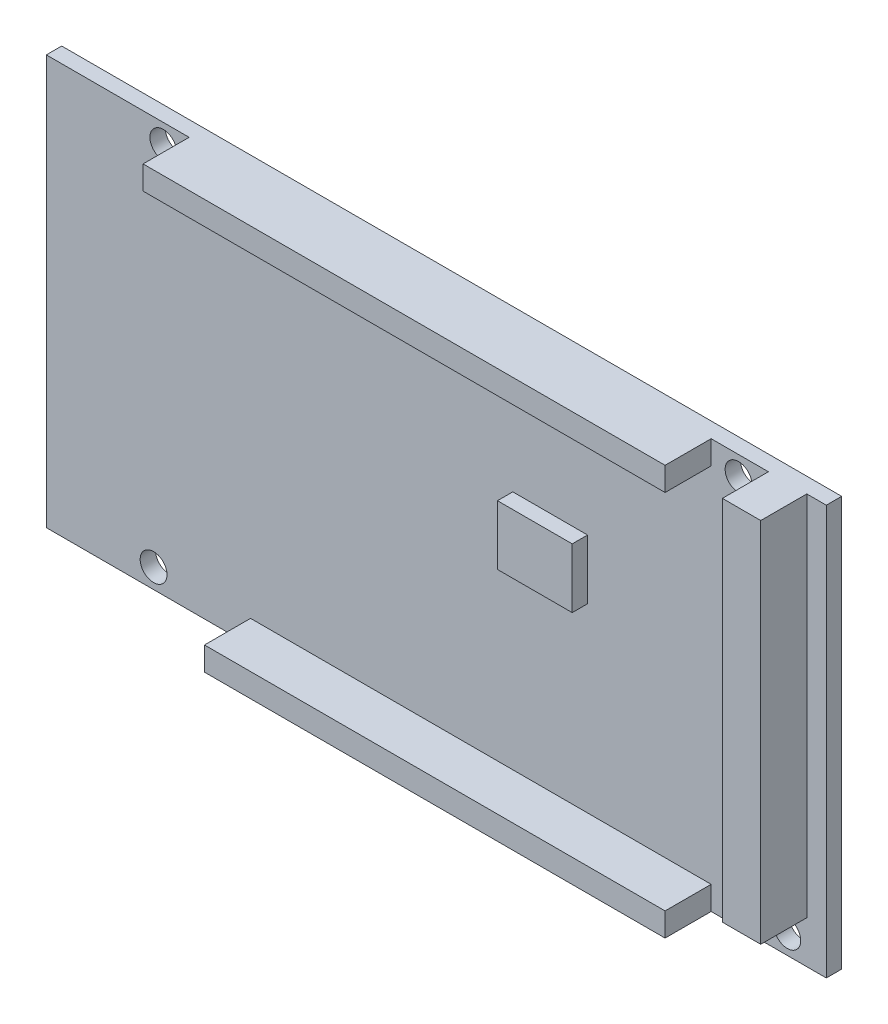
ISO-10303-21;
HEADER;
FILE_DESCRIPTION(('STEP AP214'),'2;1');
FILE_NAME('part.step','',(''),(''),'','','');
FILE_SCHEMA(('AUTOMOTIVE_DESIGN { 1 0 10303 214 1 1 1 1 }'));
ENDSEC;
DATA;
#1=APPLICATION_CONTEXT('core data for automotive mechanical design processes');
#2=APPLICATION_PROTOCOL_DEFINITION('international standard','automotive_design',2000,#1);
#3=PRODUCT_CONTEXT('',#1,'mechanical');
#4=PRODUCT('Part','Part','',(#3));
#5=PRODUCT_RELATED_PRODUCT_CATEGORY('part','',(#4));
#6=PRODUCT_DEFINITION_FORMATION('','',#4);
#7=PRODUCT_DEFINITION_CONTEXT('part definition',#1,'design');
#8=PRODUCT_DEFINITION('design','',#6,#7);
#9=PRODUCT_DEFINITION_SHAPE('','',#8);
#10=(LENGTH_UNIT() NAMED_UNIT(*) SI_UNIT(.MILLI.,.METRE.));
#11=(NAMED_UNIT(*) PLANE_ANGLE_UNIT() SI_UNIT($,.RADIAN.));
#12=(NAMED_UNIT(*) SI_UNIT($,.STERADIAN.) SOLID_ANGLE_UNIT());
#13=UNCERTAINTY_MEASURE_WITH_UNIT(LENGTH_MEASURE(1.E-05),#10,'distance_accuracy_value','');
#14=(GEOMETRIC_REPRESENTATION_CONTEXT(3) GLOBAL_UNCERTAINTY_ASSIGNED_CONTEXT((#13)) GLOBAL_UNIT_ASSIGNED_CONTEXT((#10,
#11,#12)) REPRESENTATION_CONTEXT('',''));
#15=CARTESIAN_POINT('',(0.,0.,0.));
#16=DIRECTION('',(0.,0.,1.));
#17=DIRECTION('',(1.,0.,0.));
#18=AXIS2_PLACEMENT_3D('',#15,#16,#17);
#19=CARTESIAN_POINT('',(0.,0.,2.));
#20=DIRECTION('',(0.,0.,-1.));
#21=DIRECTION('',(-1.,0.,0.));
#22=AXIS2_PLACEMENT_3D('',#19,#20,#21);
#23=PLANE('',#22);
#24=DIRECTION('',(0.,-1.,0.));
#25=VECTOR('',#24,1.);
#26=CARTESIAN_POINT('',(43.26,26.67,2.));
#27=LINE('',#26,#25);
#28=CARTESIAN_POINT('',(43.26,26.67,2.));
#29=VERTEX_POINT('',#28);
#30=CARTESIAN_POINT('',(43.26,-21.14,2.));
#31=VERTEX_POINT('',#30);
#32=EDGE_CURVE('E195',#29,#31,#27,.T.);
#33=ORIENTED_EDGE('',*,*,#32,.F.);
#34=DIRECTION('',(-1.,0.,0.));
#35=VECTOR('',#34,1.);
#36=CARTESIAN_POINT('',(-50.8,26.67,2.));
#37=LINE('',#36,#35);
#38=CARTESIAN_POINT('',(35.8,26.67,2.));
#39=VERTEX_POINT('',#38);
#40=EDGE_CURVE('E38',#29,#39,#37,.T.);
#41=ORIENTED_EDGE('',*,*,#40,.T.);
#42=DIRECTION('',(0.,1.,0.));
#43=VECTOR('',#42,1.);
#44=CARTESIAN_POINT('',(35.8,26.67,2.));
#45=LINE('',#44,#43);
#46=CARTESIAN_POINT('',(35.8,23.6,2.));
#47=VERTEX_POINT('',#46);
#48=EDGE_CURVE('E265',#47,#39,#45,.T.);
#49=ORIENTED_EDGE('',*,*,#48,.F.);
#50=DIRECTION('',(1.,0.,0.));
#51=VECTOR('',#50,1.);
#52=CARTESIAN_POINT('',(-32.2,23.6,2.));
#53=LINE('',#52,#51);
#54=CARTESIAN_POINT('',(-32.2,23.6,2.));
#55=VERTEX_POINT('',#54);
#56=EDGE_CURVE('E272',#55,#47,#53,.T.);
#57=ORIENTED_EDGE('',*,*,#56,.F.);
#58=DIRECTION('',(0.,-1.,0.));
#59=VECTOR('',#58,1.);
#60=CARTESIAN_POINT('',(-32.2,26.67,2.));
#61=LINE('',#60,#59);
#62=CARTESIAN_POINT('',(-32.2,26.67,2.));
#63=VERTEX_POINT('',#62);
#64=EDGE_CURVE('E260',#63,#55,#61,.T.);
#65=ORIENTED_EDGE('',*,*,#64,.F.);
#66=CARTESIAN_POINT('',(-50.8,26.67,2.));
#67=VERTEX_POINT('',#66);
#68=EDGE_CURVE('E302',#63,#67,#37,.T.);
#69=ORIENTED_EDGE('',*,*,#68,.T.);
#70=DIRECTION('',(0.,-1.,0.));
#71=VECTOR('',#70,1.);
#72=CARTESIAN_POINT('',(-50.8,-26.67,2.));
#73=LINE('',#72,#71);
#74=CARTESIAN_POINT('',(-50.8,-26.67,2.));
#75=VERTEX_POINT('',#74);
#76=EDGE_CURVE('E310',#67,#75,#73,.T.);
#77=ORIENTED_EDGE('',*,*,#76,.T.);
#78=DIRECTION('',(1.,0.,0.));
#79=VECTOR('',#78,1.);
#80=CARTESIAN_POINT('',(-50.8,-26.67,2.));
#81=LINE('',#80,#79);
#82=CARTESIAN_POINT('',(-24.2,-26.67,2.));
#83=VERTEX_POINT('',#82);
#84=EDGE_CURVE('E315',#75,#83,#81,.T.);
#85=ORIENTED_EDGE('',*,*,#84,.T.);
#86=DIRECTION('',(0.,-1.,0.));
#87=VECTOR('',#86,1.);
#88=CARTESIAN_POINT('',(-24.2,-26.67,2.));
#89=LINE('',#88,#87);
#90=CARTESIAN_POINT('',(-24.2,-23.6,2.));
#91=VERTEX_POINT('',#90);
#92=EDGE_CURVE('E230',#91,#83,#89,.T.);
#93=ORIENTED_EDGE('',*,*,#92,.F.);
#94=DIRECTION('',(-1.,0.,0.));
#95=VECTOR('',#94,1.);
#96=CARTESIAN_POINT('',(-24.2,-23.6,2.));
#97=LINE('',#96,#95);
#98=CARTESIAN_POINT('',(35.8,-23.6,2.));
#99=VERTEX_POINT('',#98);
#100=EDGE_CURVE('E235',#99,#91,#97,.T.);
#101=ORIENTED_EDGE('',*,*,#100,.F.);
#102=DIRECTION('',(0.,1.,0.));
#103=VECTOR('',#102,1.);
#104=CARTESIAN_POINT('',(35.8,-26.67,2.));
#105=LINE('',#104,#103);
#106=CARTESIAN_POINT('',(35.8,-26.67,2.));
#107=VERTEX_POINT('',#106);
#108=EDGE_CURVE('E244',#107,#99,#105,.T.);
#109=ORIENTED_EDGE('',*,*,#108,.F.);
#110=CARTESIAN_POINT('',(50.8,-26.67,2.));
#111=VERTEX_POINT('',#110);
#112=EDGE_CURVE('E314',#107,#111,#81,.T.);
#113=ORIENTED_EDGE('',*,*,#112,.T.);
#114=DIRECTION('',(0.,1.,0.));
#115=VECTOR('',#114,1.);
#116=CARTESIAN_POINT('',(50.8,-26.67,2.));
#117=LINE('',#116,#115);
#118=CARTESIAN_POINT('',(50.8,26.67,2.));
#119=VERTEX_POINT('',#118);
#120=EDGE_CURVE('E304',#111,#119,#117,.T.);
#121=ORIENTED_EDGE('',*,*,#120,.T.);
#122=CARTESIAN_POINT('',(48.26,26.67,2.));
#123=VERTEX_POINT('',#122);
#124=EDGE_CURVE('E305',#119,#123,#37,.T.);
#125=ORIENTED_EDGE('',*,*,#124,.T.);
#126=DIRECTION('',(0.,1.,0.));
#127=VECTOR('',#126,1.);
#128=CARTESIAN_POINT('',(48.26,26.67,2.));
#129=LINE('',#128,#127);
#130=CARTESIAN_POINT('',(48.26,-21.14,2.));
#131=VERTEX_POINT('',#130);
#132=EDGE_CURVE('E208',#131,#123,#129,.T.);
#133=ORIENTED_EDGE('',*,*,#132,.F.);
#134=DIRECTION('',(1.,0.,0.));
#135=VECTOR('',#134,1.);
#136=CARTESIAN_POINT('',(43.26,-21.14,2.));
#137=LINE('',#136,#135);
#138=EDGE_CURVE('E198',#31,#131,#137,.T.);
#139=ORIENTED_EDGE('',*,*,#138,.F.);
#140=EDGE_LOOP('',(#33,#41,#49,#57,#65,#69,#77,#85,#93,#101,#109,#113,#121,#125,#133,#139));
#141=FACE_BOUND('',#140,.T.);
#142=CARTESIAN_POINT('',(-35.56,24.13,2.));
#143=DIRECTION('',(0.,0.,1.));
#144=DIRECTION('',(1.,0.,0.));
#145=AXIS2_PLACEMENT_3D('',#142,#143,#144);
#146=CIRCLE('',#145,1.75);
#147=CARTESIAN_POINT('',(-33.81,24.13,2.));
#148=VERTEX_POINT('',#147);
#149=EDGE_CURVE('E322',#148,#148,#146,.T.);
#150=ORIENTED_EDGE('',*,*,#149,.F.);
#151=EDGE_LOOP('',(#150));
#152=FACE_BOUND('',#151,.T.);
#153=CARTESIAN_POINT('',(-36.83,-24.13,2.));
#154=DIRECTION('',(0.,0.,1.));
#155=DIRECTION('',(1.,0.,0.));
#156=AXIS2_PLACEMENT_3D('',#153,#154,#155);
#157=CIRCLE('',#156,1.75);
#158=CARTESIAN_POINT('',(-35.08,-24.13,2.));
#159=VERTEX_POINT('',#158);
#160=EDGE_CURVE('E397',#159,#159,#157,.T.);
#161=ORIENTED_EDGE('',*,*,#160,.F.);
#162=EDGE_LOOP('',(#161));
#163=FACE_BOUND('',#162,.T.);
#164=CARTESIAN_POINT('',(45.72,-24.13,2.));
#165=DIRECTION('',(0.,0.,1.));
#166=DIRECTION('',(1.,0.,0.));
#167=AXIS2_PLACEMENT_3D('',#164,#165,#166);
#168=CIRCLE('',#167,1.75);
#169=CARTESIAN_POINT('',(47.47,-24.13,2.));
#170=VERTEX_POINT('',#169);
#171=EDGE_CURVE('E391',#170,#170,#168,.T.);
#172=ORIENTED_EDGE('',*,*,#171,.F.);
#173=EDGE_LOOP('',(#172));
#174=FACE_BOUND('',#173,.T.);
#175=CARTESIAN_POINT('',(39.37,24.13,2.));
#176=DIRECTION('',(0.,0.,1.));
#177=DIRECTION('',(1.,0.,0.));
#178=AXIS2_PLACEMENT_3D('',#175,#176,#177);
#179=CIRCLE('',#178,1.75);
#180=CARTESIAN_POINT('',(41.12,24.13,2.));
#181=VERTEX_POINT('',#180);
#182=EDGE_CURVE('E385',#181,#181,#179,.T.);
#183=ORIENTED_EDGE('',*,*,#182,.F.);
#184=EDGE_LOOP('',(#183));
#185=FACE_BOUND('',#184,.T.);
#186=DIRECTION('',(0.,-1.,0.));
#187=VECTOR('',#186,1.);
#188=CARTESIAN_POINT('',(9.96353676061924,0.,2.));
#189=LINE('',#188,#187);
#190=CARTESIAN_POINT('',(9.96353676061924,7.75574232218655,2.));
#191=VERTEX_POINT('',#190);
#192=CARTESIAN_POINT('',(9.96353676061924,0.,2.));
#193=VERTEX_POINT('',#192);
#194=EDGE_CURVE('E194',#191,#193,#189,.T.);
#195=ORIENTED_EDGE('',*,*,#194,.F.);
#196=DIRECTION('',(-1.,0.,0.));
#197=VECTOR('',#196,1.);
#198=CARTESIAN_POINT('',(9.96353676061924,7.75574232218655,2.));
#199=LINE('',#198,#197);
#200=CARTESIAN_POINT('',(19.7006417198608,7.75574232218655,2.));
#201=VERTEX_POINT('',#200);
#202=EDGE_CURVE('E191',#201,#191,#199,.T.);
#203=ORIENTED_EDGE('',*,*,#202,.F.);
#204=DIRECTION('',(0.,1.,0.));
#205=VECTOR('',#204,1.);
#206=CARTESIAN_POINT('',(19.7006417198608,0.,2.));
#207=LINE('',#206,#205);
#208=CARTESIAN_POINT('',(19.7006417198608,0.,2.));
#209=VERTEX_POINT('',#208);
#210=EDGE_CURVE('E57',#209,#201,#207,.T.);
#211=ORIENTED_EDGE('',*,*,#210,.F.);
#212=DIRECTION('',(1.,0.,0.));
#213=VECTOR('',#212,1.);
#214=CARTESIAN_POINT('',(9.96353676061924,0.,2.));
#215=LINE('',#214,#213);
#216=EDGE_CURVE('E52',#193,#209,#215,.T.);
#217=ORIENTED_EDGE('',*,*,#216,.F.);
#218=EDGE_LOOP('',(#195,#203,#211,#217));
#219=FACE_BOUND('',#218,.T.);
#220=ADVANCED_FACE('F34',(#141,#152,#163,#174,#185,#219),#23,.F.);
#221=CARTESIAN_POINT('',(0.,0.,0.));
#222=DIRECTION('',(0.,0.,-1.));
#223=DIRECTION('',(-1.,0.,0.));
#224=AXIS2_PLACEMENT_3D('',#221,#222,#223);
#225=PLANE('',#224);
#226=CARTESIAN_POINT('',(45.72,-24.13,0.));
#227=DIRECTION('',(0.,0.,1.));
#228=DIRECTION('',(1.,0.,0.));
#229=AXIS2_PLACEMENT_3D('',#226,#227,#228);
#230=CIRCLE('',#229,1.75);
#231=CARTESIAN_POINT('',(47.47,-24.13,0.));
#232=VERTEX_POINT('',#231);
#233=EDGE_CURVE('E389',#232,#232,#230,.T.);
#234=ORIENTED_EDGE('',*,*,#233,.T.);
#235=EDGE_LOOP('',(#234));
#236=FACE_BOUND('',#235,.T.);
#237=CARTESIAN_POINT('',(-35.56,24.13,0.));
#238=DIRECTION('',(0.,0.,1.));
#239=DIRECTION('',(1.,0.,0.));
#240=AXIS2_PLACEMENT_3D('',#237,#238,#239);
#241=CIRCLE('',#240,1.75);
#242=CARTESIAN_POINT('',(-33.81,24.13,0.));
#243=VERTEX_POINT('',#242);
#244=EDGE_CURVE('E400',#243,#243,#241,.T.);
#245=ORIENTED_EDGE('',*,*,#244,.T.);
#246=EDGE_LOOP('',(#245));
#247=FACE_BOUND('',#246,.T.);
#248=DIRECTION('',(0.,1.,0.));
#249=VECTOR('',#248,1.);
#250=CARTESIAN_POINT('',(50.8,-26.67,0.));
#251=LINE('',#250,#249);
#252=CARTESIAN_POINT('',(50.8,-26.67,0.));
#253=VERTEX_POINT('',#252);
#254=CARTESIAN_POINT('',(50.8,26.67,0.));
#255=VERTEX_POINT('',#254);
#256=EDGE_CURVE('E318',#253,#255,#251,.T.);
#257=ORIENTED_EDGE('',*,*,#256,.F.);
#258=DIRECTION('',(1.,0.,0.));
#259=VECTOR('',#258,1.);
#260=CARTESIAN_POINT('',(-50.8,-26.67,0.));
#261=LINE('',#260,#259);
#262=CARTESIAN_POINT('',(-50.8,-26.67,0.));
#263=VERTEX_POINT('',#262);
#264=EDGE_CURVE('E326',#263,#253,#261,.T.);
#265=ORIENTED_EDGE('',*,*,#264,.F.);
#266=DIRECTION('',(0.,-1.,0.));
#267=VECTOR('',#266,1.);
#268=CARTESIAN_POINT('',(-50.8,-26.67,0.));
#269=LINE('',#268,#267);
#270=CARTESIAN_POINT('',(-50.8,26.67,0.));
#271=VERTEX_POINT('',#270);
#272=EDGE_CURVE('E324',#271,#263,#269,.T.);
#273=ORIENTED_EDGE('',*,*,#272,.F.);
#274=DIRECTION('',(-1.,0.,0.));
#275=VECTOR('',#274,1.);
#276=CARTESIAN_POINT('',(-50.8,26.67,0.));
#277=LINE('',#276,#275);
#278=EDGE_CURVE('E321',#255,#271,#277,.T.);
#279=ORIENTED_EDGE('',*,*,#278,.F.);
#280=EDGE_LOOP('',(#257,#265,#273,#279));
#281=FACE_BOUND('',#280,.T.);
#282=CARTESIAN_POINT('',(-36.83,-24.13,0.));
#283=DIRECTION('',(0.,0.,1.));
#284=DIRECTION('',(1.,0.,0.));
#285=AXIS2_PLACEMENT_3D('',#282,#283,#284);
#286=CIRCLE('',#285,1.75);
#287=CARTESIAN_POINT('',(-35.08,-24.13,0.));
#288=VERTEX_POINT('',#287);
#289=EDGE_CURVE('E394',#288,#288,#286,.T.);
#290=ORIENTED_EDGE('',*,*,#289,.T.);
#291=EDGE_LOOP('',(#290));
#292=FACE_BOUND('',#291,.T.);
#293=CARTESIAN_POINT('',(39.37,24.13,0.));
#294=DIRECTION('',(0.,0.,1.));
#295=DIRECTION('',(1.,0.,0.));
#296=AXIS2_PLACEMENT_3D('',#293,#294,#295);
#297=CIRCLE('',#296,1.75);
#298=CARTESIAN_POINT('',(41.12,24.13,0.));
#299=VERTEX_POINT('',#298);
#300=EDGE_CURVE('E383',#299,#299,#297,.T.);
#301=ORIENTED_EDGE('',*,*,#300,.T.);
#302=EDGE_LOOP('',(#301));
#303=FACE_BOUND('',#302,.T.);
#304=ADVANCED_FACE('F344',(#236,#247,#281,#292,#303),#225,.T.);
#305=CARTESIAN_POINT('',(50.8,-26.67,2.));
#306=DIRECTION('',(-1.,0.,0.));
#307=DIRECTION('',(0.,0.,1.));
#308=AXIS2_PLACEMENT_3D('',#305,#306,#307);
#309=PLANE('',#308);
#310=ORIENTED_EDGE('',*,*,#256,.T.);
#311=DIRECTION('',(0.,0.,-1.));
#312=VECTOR('',#311,1.);
#313=CARTESIAN_POINT('',(50.8,26.67,2.));
#314=LINE('',#313,#312);
#315=EDGE_CURVE('E11',#119,#255,#314,.T.);
#316=ORIENTED_EDGE('',*,*,#315,.F.);
#317=ORIENTED_EDGE('',*,*,#120,.F.);
#318=DIRECTION('',(0.,0.,-1.));
#319=VECTOR('',#318,1.);
#320=CARTESIAN_POINT('',(50.8,-26.67,2.));
#321=LINE('',#320,#319);
#322=EDGE_CURVE('E317',#111,#253,#321,.T.);
#323=ORIENTED_EDGE('',*,*,#322,.T.);
#324=EDGE_LOOP('',(#310,#316,#317,#323));
#325=FACE_BOUND('',#324,.T.);
#326=ADVANCED_FACE('F36',(#325),#309,.F.);
#327=CARTESIAN_POINT('',(-50.8,26.67,2.));
#328=DIRECTION('',(0.,-1.,0.));
#329=DIRECTION('',(0.,0.,-1.));
#330=AXIS2_PLACEMENT_3D('',#327,#328,#329);
#331=PLANE('',#330);
#332=ORIENTED_EDGE('',*,*,#278,.T.);
#333=DIRECTION('',(0.,0.,-1.));
#334=VECTOR('',#333,1.);
#335=CARTESIAN_POINT('',(-50.8,26.67,2.));
#336=LINE('',#335,#334);
#337=EDGE_CURVE('E44',#67,#271,#336,.T.);
#338=ORIENTED_EDGE('',*,*,#337,.F.);
#339=ORIENTED_EDGE('',*,*,#68,.F.);
#340=DIRECTION('',(0.,0.,-1.));
#341=VECTOR('',#340,1.);
#342=CARTESIAN_POINT('',(-32.2,26.67,8.));
#343=LINE('',#342,#341);
#344=CARTESIAN_POINT('',(-32.2,26.67,8.));
#345=VERTEX_POINT('',#344);
#346=EDGE_CURVE('E271',#345,#63,#343,.T.);
#347=ORIENTED_EDGE('',*,*,#346,.F.);
#348=DIRECTION('',(-1.,0.,0.));
#349=VECTOR('',#348,1.);
#350=CARTESIAN_POINT('',(-32.2,26.67,8.));
#351=LINE('',#350,#349);
#352=CARTESIAN_POINT('',(35.8,26.67,8.));
#353=VERTEX_POINT('',#352);
#354=EDGE_CURVE('E269',#353,#345,#351,.T.);
#355=ORIENTED_EDGE('',*,*,#354,.F.);
#356=DIRECTION('',(0.,0.,-1.));
#357=VECTOR('',#356,1.);
#358=CARTESIAN_POINT('',(35.8,26.67,8.));
#359=LINE('',#358,#357);
#360=EDGE_CURVE('E285',#353,#39,#359,.T.);
#361=ORIENTED_EDGE('',*,*,#360,.T.);
#362=ORIENTED_EDGE('',*,*,#40,.F.);
#363=DIRECTION('',(0.,0.,-1.));
#364=VECTOR('',#363,1.);
#365=CARTESIAN_POINT('',(43.26,26.67,8.));
#366=LINE('',#365,#364);
#367=CARTESIAN_POINT('',(43.26,26.67,8.));
#368=VERTEX_POINT('',#367);
#369=EDGE_CURVE('E213',#368,#29,#366,.T.);
#370=ORIENTED_EDGE('',*,*,#369,.F.);
#371=DIRECTION('',(-1.,0.,0.));
#372=VECTOR('',#371,1.);
#373=CARTESIAN_POINT('',(43.26,26.67,8.));
#374=LINE('',#373,#372);
#375=CARTESIAN_POINT('',(48.26,26.67,8.));
#376=VERTEX_POINT('',#375);
#377=EDGE_CURVE('E212',#376,#368,#374,.T.);
#378=ORIENTED_EDGE('',*,*,#377,.F.);
#379=DIRECTION('',(0.,0.,-1.));
#380=VECTOR('',#379,1.);
#381=CARTESIAN_POINT('',(48.26,26.67,8.));
#382=LINE('',#381,#380);
#383=EDGE_CURVE('E221',#376,#123,#382,.T.);
#384=ORIENTED_EDGE('',*,*,#383,.T.);
#385=ORIENTED_EDGE('',*,*,#124,.F.);
#386=ORIENTED_EDGE('',*,*,#315,.T.);
#387=EDGE_LOOP('',(#332,#338,#339,#347,#355,#361,#362,#370,#378,#384,#385,#386));
#388=FACE_BOUND('',#387,.T.);
#389=ADVANCED_FACE('F371',(#388),#331,.F.);
#390=CARTESIAN_POINT('',(-50.8,-26.67,2.));
#391=DIRECTION('',(1.,0.,0.));
#392=DIRECTION('',(0.,0.,-1.));
#393=AXIS2_PLACEMENT_3D('',#390,#391,#392);
#394=PLANE('',#393);
#395=ORIENTED_EDGE('',*,*,#272,.T.);
#396=DIRECTION('',(0.,0.,-1.));
#397=VECTOR('',#396,1.);
#398=CARTESIAN_POINT('',(-50.8,-26.67,2.));
#399=LINE('',#398,#397);
#400=EDGE_CURVE('E330',#75,#263,#399,.T.);
#401=ORIENTED_EDGE('',*,*,#400,.F.);
#402=ORIENTED_EDGE('',*,*,#76,.F.);
#403=ORIENTED_EDGE('',*,*,#337,.T.);
#404=EDGE_LOOP('',(#395,#401,#402,#403));
#405=FACE_BOUND('',#404,.T.);
#406=ADVANCED_FACE('F338',(#405),#394,.F.);
#407=CARTESIAN_POINT('',(-50.8,-26.67,2.));
#408=DIRECTION('',(0.,1.,0.));
#409=DIRECTION('',(0.,0.,1.));
#410=AXIS2_PLACEMENT_3D('',#407,#408,#409);
#411=PLANE('',#410);
#412=ORIENTED_EDGE('',*,*,#264,.T.);
#413=ORIENTED_EDGE('',*,*,#322,.F.);
#414=ORIENTED_EDGE('',*,*,#112,.F.);
#415=DIRECTION('',(0.,0.,-1.));
#416=VECTOR('',#415,1.);
#417=CARTESIAN_POINT('',(35.8,-26.67,8.));
#418=LINE('',#417,#416);
#419=CARTESIAN_POINT('',(35.8,-26.67,8.));
#420=VERTEX_POINT('',#419);
#421=EDGE_CURVE('E254',#420,#107,#418,.T.);
#422=ORIENTED_EDGE('',*,*,#421,.F.);
#423=DIRECTION('',(1.,0.,0.));
#424=VECTOR('',#423,1.);
#425=CARTESIAN_POINT('',(-24.2,-26.67,8.));
#426=LINE('',#425,#424);
#427=CARTESIAN_POINT('',(-24.2,-26.67,8.));
#428=VERTEX_POINT('',#427);
#429=EDGE_CURVE('E234',#428,#420,#426,.T.);
#430=ORIENTED_EDGE('',*,*,#429,.F.);
#431=DIRECTION('',(0.,0.,-1.));
#432=VECTOR('',#431,1.);
#433=CARTESIAN_POINT('',(-24.2,-26.67,8.));
#434=LINE('',#433,#432);
#435=EDGE_CURVE('E257',#428,#83,#434,.T.);
#436=ORIENTED_EDGE('',*,*,#435,.T.);
#437=ORIENTED_EDGE('',*,*,#84,.F.);
#438=ORIENTED_EDGE('',*,*,#400,.T.);
#439=EDGE_LOOP('',(#412,#413,#414,#422,#430,#436,#437,#438));
#440=FACE_BOUND('',#439,.T.);
#441=ADVANCED_FACE('F348',(#440),#411,.F.);
#442=CARTESIAN_POINT('',(-35.56,24.13,2.));
#443=DIRECTION('',(0.,0.,-1.));
#444=DIRECTION('',(-1.,0.,0.));
#445=AXIS2_PLACEMENT_3D('',#442,#443,#444);
#446=CYLINDRICAL_SURFACE('',#445,1.75);
#447=ORIENTED_EDGE('',*,*,#149,.T.);
#448=EDGE_LOOP('',(#447));
#449=FACE_BOUND('',#448,.T.);
#450=ORIENTED_EDGE('',*,*,#244,.F.);
#451=EDGE_LOOP('',(#450));
#452=FACE_BOUND('',#451,.T.);
#453=ADVANCED_FACE('F408',(#449,#452),#446,.F.);
#454=CARTESIAN_POINT('',(-36.83,-24.13,2.));
#455=DIRECTION('',(0.,0.,-1.));
#456=DIRECTION('',(-1.,0.,0.));
#457=AXIS2_PLACEMENT_3D('',#454,#455,#456);
#458=CYLINDRICAL_SURFACE('',#457,1.75);
#459=ORIENTED_EDGE('',*,*,#160,.T.);
#460=EDGE_LOOP('',(#459));
#461=FACE_BOUND('',#460,.T.);
#462=ORIENTED_EDGE('',*,*,#289,.F.);
#463=EDGE_LOOP('',(#462));
#464=FACE_BOUND('',#463,.T.);
#465=ADVANCED_FACE('F410',(#461,#464),#458,.F.);
#466=CARTESIAN_POINT('',(45.72,-24.13,2.));
#467=DIRECTION('',(0.,0.,-1.));
#468=DIRECTION('',(-1.,0.,0.));
#469=AXIS2_PLACEMENT_3D('',#466,#467,#468);
#470=CYLINDRICAL_SURFACE('',#469,1.75);
#471=ORIENTED_EDGE('',*,*,#171,.T.);
#472=EDGE_LOOP('',(#471));
#473=FACE_BOUND('',#472,.T.);
#474=ORIENTED_EDGE('',*,*,#233,.F.);
#475=EDGE_LOOP('',(#474));
#476=FACE_BOUND('',#475,.T.);
#477=ADVANCED_FACE('F417',(#473,#476),#470,.F.);
#478=CARTESIAN_POINT('',(39.37,24.13,2.));
#479=DIRECTION('',(0.,0.,-1.));
#480=DIRECTION('',(-1.,0.,0.));
#481=AXIS2_PLACEMENT_3D('',#478,#479,#480);
#482=CYLINDRICAL_SURFACE('',#481,1.75);
#483=ORIENTED_EDGE('',*,*,#182,.T.);
#484=EDGE_LOOP('',(#483));
#485=FACE_BOUND('',#484,.T.);
#486=ORIENTED_EDGE('',*,*,#300,.F.);
#487=EDGE_LOOP('',(#486));
#488=FACE_BOUND('',#487,.T.);
#489=ADVANCED_FACE('F481',(#485,#488),#482,.F.);
#490=CARTESIAN_POINT('',(-32.2,26.67,8.));
#491=DIRECTION('',(1.,0.,0.));
#492=DIRECTION('',(0.,1.,0.));
#493=AXIS2_PLACEMENT_3D('',#490,#491,#492);
#494=PLANE('',#493);
#495=ORIENTED_EDGE('',*,*,#64,.T.);
#496=DIRECTION('',(0.,0.,-1.));
#497=VECTOR('',#496,1.);
#498=CARTESIAN_POINT('',(-32.2,23.6,8.));
#499=LINE('',#498,#497);
#500=CARTESIAN_POINT('',(-32.2,23.6,8.));
#501=VERTEX_POINT('',#500);
#502=EDGE_CURVE('E292',#501,#55,#499,.T.);
#503=ORIENTED_EDGE('',*,*,#502,.F.);
#504=DIRECTION('',(0.,-1.,0.));
#505=VECTOR('',#504,1.);
#506=CARTESIAN_POINT('',(-32.2,26.67,8.));
#507=LINE('',#506,#505);
#508=EDGE_CURVE('E261',#345,#501,#507,.T.);
#509=ORIENTED_EDGE('',*,*,#508,.F.);
#510=ORIENTED_EDGE('',*,*,#346,.T.);
#511=EDGE_LOOP('',(#495,#503,#509,#510));
#512=FACE_BOUND('',#511,.T.);
#513=ADVANCED_FACE('F373',(#512),#494,.F.);
#514=CARTESIAN_POINT('',(-32.2,23.6,8.));
#515=DIRECTION('',(0.,1.,0.));
#516=DIRECTION('',(0.,0.,1.));
#517=AXIS2_PLACEMENT_3D('',#514,#515,#516);
#518=PLANE('',#517);
#519=ORIENTED_EDGE('',*,*,#56,.T.);
#520=DIRECTION('',(0.,0.,-1.));
#521=VECTOR('',#520,1.);
#522=CARTESIAN_POINT('',(35.8,23.6,8.));
#523=LINE('',#522,#521);
#524=CARTESIAN_POINT('',(35.8,23.6,8.));
#525=VERTEX_POINT('',#524);
#526=EDGE_CURVE('E277',#525,#47,#523,.T.);
#527=ORIENTED_EDGE('',*,*,#526,.F.);
#528=DIRECTION('',(1.,0.,0.));
#529=VECTOR('',#528,1.);
#530=CARTESIAN_POINT('',(-32.2,23.6,8.));
#531=LINE('',#530,#529);
#532=EDGE_CURVE('E264',#501,#525,#531,.T.);
#533=ORIENTED_EDGE('',*,*,#532,.F.);
#534=ORIENTED_EDGE('',*,*,#502,.T.);
#535=EDGE_LOOP('',(#519,#527,#533,#534));
#536=FACE_BOUND('',#535,.T.);
#537=ADVANCED_FACE('F382',(#536),#518,.F.);
#538=CARTESIAN_POINT('',(35.8,26.67,8.));
#539=DIRECTION('',(-1.,0.,0.));
#540=DIRECTION('',(0.,0.,1.));
#541=AXIS2_PLACEMENT_3D('',#538,#539,#540);
#542=PLANE('',#541);
#543=ORIENTED_EDGE('',*,*,#48,.T.);
#544=ORIENTED_EDGE('',*,*,#360,.F.);
#545=DIRECTION('',(0.,1.,0.));
#546=VECTOR('',#545,1.);
#547=CARTESIAN_POINT('',(35.8,26.67,8.));
#548=LINE('',#547,#546);
#549=EDGE_CURVE('E267',#525,#353,#548,.T.);
#550=ORIENTED_EDGE('',*,*,#549,.F.);
#551=ORIENTED_EDGE('',*,*,#526,.T.);
#552=EDGE_LOOP('',(#543,#544,#550,#551));
#553=FACE_BOUND('',#552,.T.);
#554=ADVANCED_FACE('F380',(#553),#542,.F.);
#555=CARTESIAN_POINT('',(0.,0.,8.));
#556=DIRECTION('',(0.,0.,1.));
#557=DIRECTION('',(1.,0.,0.));
#558=AXIS2_PLACEMENT_3D('',#555,#556,#557);
#559=PLANE('',#558);
#560=ORIENTED_EDGE('',*,*,#508,.T.);
#561=ORIENTED_EDGE('',*,*,#532,.T.);
#562=ORIENTED_EDGE('',*,*,#549,.T.);
#563=ORIENTED_EDGE('',*,*,#354,.T.);
#564=EDGE_LOOP('',(#560,#561,#562,#563));
#565=FACE_BOUND('',#564,.T.);
#566=ADVANCED_FACE('F376',(#565),#559,.T.);
#567=CARTESIAN_POINT('',(-24.2,-26.67,8.));
#568=DIRECTION('',(1.,0.,0.));
#569=DIRECTION('',(0.,0.,-1.));
#570=AXIS2_PLACEMENT_3D('',#567,#568,#569);
#571=PLANE('',#570);
#572=ORIENTED_EDGE('',*,*,#92,.T.);
#573=ORIENTED_EDGE('',*,*,#435,.F.);
#574=DIRECTION('',(0.,-1.,0.));
#575=VECTOR('',#574,1.);
#576=CARTESIAN_POINT('',(-24.2,-26.67,8.));
#577=LINE('',#576,#575);
#578=CARTESIAN_POINT('',(-24.2,-23.6,8.));
#579=VERTEX_POINT('',#578);
#580=EDGE_CURVE('E231',#579,#428,#577,.T.);
#581=ORIENTED_EDGE('',*,*,#580,.F.);
#582=DIRECTION('',(0.,0.,-1.));
#583=VECTOR('',#582,1.);
#584=CARTESIAN_POINT('',(-24.2,-23.6,8.));
#585=LINE('',#584,#583);
#586=EDGE_CURVE('E241',#579,#91,#585,.T.);
#587=ORIENTED_EDGE('',*,*,#586,.T.);
#588=EDGE_LOOP('',(#572,#573,#581,#587));
#589=FACE_BOUND('',#588,.T.);
#590=ADVANCED_FACE('F370',(#589),#571,.F.);
#591=CARTESIAN_POINT('',(35.8,-26.67,8.));
#592=DIRECTION('',(-1.,0.,0.));
#593=DIRECTION('',(0.,0.,1.));
#594=AXIS2_PLACEMENT_3D('',#591,#592,#593);
#595=PLANE('',#594);
#596=ORIENTED_EDGE('',*,*,#108,.T.);
#597=DIRECTION('',(0.,0.,-1.));
#598=VECTOR('',#597,1.);
#599=CARTESIAN_POINT('',(35.8,-23.6,8.));
#600=LINE('',#599,#598);
#601=CARTESIAN_POINT('',(35.8,-23.6,8.));
#602=VERTEX_POINT('',#601);
#603=EDGE_CURVE('E251',#602,#99,#600,.T.);
#604=ORIENTED_EDGE('',*,*,#603,.F.);
#605=DIRECTION('',(0.,1.,0.));
#606=VECTOR('',#605,1.);
#607=CARTESIAN_POINT('',(35.8,-26.67,8.));
#608=LINE('',#607,#606);
#609=EDGE_CURVE('E237',#420,#602,#608,.T.);
#610=ORIENTED_EDGE('',*,*,#609,.F.);
#611=ORIENTED_EDGE('',*,*,#421,.T.);
#612=EDGE_LOOP('',(#596,#604,#610,#611));
#613=FACE_BOUND('',#612,.T.);
#614=ADVANCED_FACE('F362',(#613),#595,.F.);
#615=CARTESIAN_POINT('',(-24.2,-23.6,8.));
#616=DIRECTION('',(0.,-1.,0.));
#617=DIRECTION('',(0.,0.,-1.));
#618=AXIS2_PLACEMENT_3D('',#615,#616,#617);
#619=PLANE('',#618);
#620=ORIENTED_EDGE('',*,*,#100,.T.);
#621=ORIENTED_EDGE('',*,*,#586,.F.);
#622=DIRECTION('',(-1.,0.,0.));
#623=VECTOR('',#622,1.);
#624=CARTESIAN_POINT('',(-24.2,-23.6,8.));
#625=LINE('',#624,#623);
#626=EDGE_CURVE('E239',#602,#579,#625,.T.);
#627=ORIENTED_EDGE('',*,*,#626,.F.);
#628=ORIENTED_EDGE('',*,*,#603,.T.);
#629=EDGE_LOOP('',(#620,#621,#627,#628));
#630=FACE_BOUND('',#629,.T.);
#631=ADVANCED_FACE('F542',(#630),#619,.F.);
#632=CARTESIAN_POINT('',(0.,0.,8.));
#633=DIRECTION('',(0.,0.,-1.));
#634=DIRECTION('',(-1.,0.,0.));
#635=AXIS2_PLACEMENT_3D('',#632,#633,#634);
#636=PLANE('',#635);
#637=ORIENTED_EDGE('',*,*,#580,.T.);
#638=ORIENTED_EDGE('',*,*,#429,.T.);
#639=ORIENTED_EDGE('',*,*,#609,.T.);
#640=ORIENTED_EDGE('',*,*,#626,.T.);
#641=EDGE_LOOP('',(#637,#638,#639,#640));
#642=FACE_BOUND('',#641,.T.);
#643=ADVANCED_FACE('F365',(#642),#636,.F.);
#644=CARTESIAN_POINT('',(43.26,26.67,8.));
#645=DIRECTION('',(1.,0.,0.));
#646=DIRECTION('',(0.,1.,0.));
#647=AXIS2_PLACEMENT_3D('',#644,#645,#646);
#648=PLANE('',#647);
#649=ORIENTED_EDGE('',*,*,#32,.T.);
#650=DIRECTION('',(0.,0.,-1.));
#651=VECTOR('',#650,1.);
#652=CARTESIAN_POINT('',(43.26,-21.14,8.));
#653=LINE('',#652,#651);
#654=CARTESIAN_POINT('',(43.26,-21.14,8.));
#655=VERTEX_POINT('',#654);
#656=EDGE_CURVE('E227',#655,#31,#653,.T.);
#657=ORIENTED_EDGE('',*,*,#656,.F.);
#658=DIRECTION('',(0.,-1.,0.));
#659=VECTOR('',#658,1.);
#660=CARTESIAN_POINT('',(43.26,26.67,8.));
#661=LINE('',#660,#659);
#662=EDGE_CURVE('E204',#368,#655,#661,.T.);
#663=ORIENTED_EDGE('',*,*,#662,.F.);
#664=ORIENTED_EDGE('',*,*,#369,.T.);
#665=EDGE_LOOP('',(#649,#657,#663,#664));
#666=FACE_BOUND('',#665,.T.);
#667=ADVANCED_FACE('F560',(#666),#648,.F.);
#668=CARTESIAN_POINT('',(43.26,-21.14,8.));
#669=DIRECTION('',(0.,1.,0.));
#670=DIRECTION('',(-1.,0.,0.));
#671=AXIS2_PLACEMENT_3D('',#668,#669,#670);
#672=PLANE('',#671);
#673=ORIENTED_EDGE('',*,*,#138,.T.);
#674=DIRECTION('',(0.,0.,-1.));
#675=VECTOR('',#674,1.);
#676=CARTESIAN_POINT('',(48.26,-21.14,8.));
#677=LINE('',#676,#675);
#678=CARTESIAN_POINT('',(48.26,-21.14,8.));
#679=VERTEX_POINT('',#678);
#680=EDGE_CURVE('E224',#679,#131,#677,.T.);
#681=ORIENTED_EDGE('',*,*,#680,.F.);
#682=DIRECTION('',(1.,0.,0.));
#683=VECTOR('',#682,1.);
#684=CARTESIAN_POINT('',(43.26,-21.14,8.));
#685=LINE('',#684,#683);
#686=EDGE_CURVE('E207',#655,#679,#685,.T.);
#687=ORIENTED_EDGE('',*,*,#686,.F.);
#688=ORIENTED_EDGE('',*,*,#656,.T.);
#689=EDGE_LOOP('',(#673,#681,#687,#688));
#690=FACE_BOUND('',#689,.T.);
#691=ADVANCED_FACE('F569',(#690),#672,.F.);
#692=CARTESIAN_POINT('',(48.26,26.67,8.));
#693=DIRECTION('',(-1.,0.,0.));
#694=DIRECTION('',(0.,-1.,0.));
#695=AXIS2_PLACEMENT_3D('',#692,#693,#694);
#696=PLANE('',#695);
#697=ORIENTED_EDGE('',*,*,#132,.T.);
#698=ORIENTED_EDGE('',*,*,#383,.F.);
#699=DIRECTION('',(0.,1.,0.));
#700=VECTOR('',#699,1.);
#701=CARTESIAN_POINT('',(48.26,26.67,8.));
#702=LINE('',#701,#700);
#703=EDGE_CURVE('E210',#679,#376,#702,.T.);
#704=ORIENTED_EDGE('',*,*,#703,.F.);
#705=ORIENTED_EDGE('',*,*,#680,.T.);
#706=EDGE_LOOP('',(#697,#698,#704,#705));
#707=FACE_BOUND('',#706,.T.);
#708=ADVANCED_FACE('F579',(#707),#696,.F.);
#709=CARTESIAN_POINT('',(0.,0.,8.));
#710=DIRECTION('',(0.,0.,1.));
#711=DIRECTION('',(1.,0.,0.));
#712=AXIS2_PLACEMENT_3D('',#709,#710,#711);
#713=PLANE('',#712);
#714=ORIENTED_EDGE('',*,*,#662,.T.);
#715=ORIENTED_EDGE('',*,*,#686,.T.);
#716=ORIENTED_EDGE('',*,*,#703,.T.);
#717=ORIENTED_EDGE('',*,*,#377,.T.);
#718=EDGE_LOOP('',(#714,#715,#716,#717));
#719=FACE_BOUND('',#718,.T.);
#720=ADVANCED_FACE('F589',(#719),#713,.T.);
#721=CARTESIAN_POINT('',(9.96353676061924,0.,4.));
#722=DIRECTION('',(1.,0.,0.));
#723=DIRECTION('',(0.,0.,-1.));
#724=AXIS2_PLACEMENT_3D('',#721,#722,#723);
#725=PLANE('',#724);
#726=ORIENTED_EDGE('',*,*,#194,.T.);
#727=DIRECTION('',(0.,0.,-1.));
#728=VECTOR('',#727,1.);
#729=CARTESIAN_POINT('',(9.96353676061924,0.,4.));
#730=LINE('',#729,#728);
#731=CARTESIAN_POINT('',(9.96353676061924,0.,4.));
#732=VERTEX_POINT('',#731);
#733=EDGE_CURVE('E175',#732,#193,#730,.T.);
#734=ORIENTED_EDGE('',*,*,#733,.F.);
#735=DIRECTION('',(0.,-1.,0.));
#736=VECTOR('',#735,1.);
#737=CARTESIAN_POINT('',(9.96353676061924,0.,4.));
#738=LINE('',#737,#736);
#739=CARTESIAN_POINT('',(9.96353676061924,7.75574232218655,4.));
#740=VERTEX_POINT('',#739);
#741=EDGE_CURVE('E182',#740,#732,#738,.T.);
#742=ORIENTED_EDGE('',*,*,#741,.F.);
#743=DIRECTION('',(0.,0.,-1.));
#744=VECTOR('',#743,1.);
#745=CARTESIAN_POINT('',(9.96353676061924,7.75574232218655,4.));
#746=LINE('',#745,#744);
#747=EDGE_CURVE('E653',#740,#191,#746,.T.);
#748=ORIENTED_EDGE('',*,*,#747,.T.);
#749=EDGE_LOOP('',(#726,#734,#742,#748));
#750=FACE_BOUND('',#749,.T.);
#751=ADVANCED_FACE('F193',(#750),#725,.F.);
#752=CARTESIAN_POINT('',(9.96353676061924,0.,4.));
#753=DIRECTION('',(0.,1.,0.));
#754=DIRECTION('',(0.,0.,1.));
#755=AXIS2_PLACEMENT_3D('',#752,#753,#754);
#756=PLANE('',#755);
#757=ORIENTED_EDGE('',*,*,#216,.T.);
#758=DIRECTION('',(0.,0.,-1.));
#759=VECTOR('',#758,1.);
#760=CARTESIAN_POINT('',(19.7006417198608,0.,4.));
#761=LINE('',#760,#759);
#762=CARTESIAN_POINT('',(19.7006417198608,0.,4.));
#763=VERTEX_POINT('',#762);
#764=EDGE_CURVE('E178',#763,#209,#761,.T.);
#765=ORIENTED_EDGE('',*,*,#764,.F.);
#766=DIRECTION('',(1.,0.,0.));
#767=VECTOR('',#766,1.);
#768=CARTESIAN_POINT('',(9.96353676061924,0.,4.));
#769=LINE('',#768,#767);
#770=EDGE_CURVE('E171',#732,#763,#769,.T.);
#771=ORIENTED_EDGE('',*,*,#770,.F.);
#772=ORIENTED_EDGE('',*,*,#733,.T.);
#773=EDGE_LOOP('',(#757,#765,#771,#772));
#774=FACE_BOUND('',#773,.T.);
#775=ADVANCED_FACE('F173',(#774),#756,.F.);
#776=CARTESIAN_POINT('',(19.7006417198608,0.,4.));
#777=DIRECTION('',(-1.,0.,0.));
#778=DIRECTION('',(0.,0.,1.));
#779=AXIS2_PLACEMENT_3D('',#776,#777,#778);
#780=PLANE('',#779);
#781=ORIENTED_EDGE('',*,*,#210,.T.);
#782=DIRECTION('',(0.,0.,-1.));
#783=VECTOR('',#782,1.);
#784=CARTESIAN_POINT('',(19.7006417198608,7.75574232218655,4.));
#785=LINE('',#784,#783);
#786=CARTESIAN_POINT('',(19.7006417198608,7.75574232218655,4.));
#787=VERTEX_POINT('',#786);
#788=EDGE_CURVE('E200',#787,#201,#785,.T.);
#789=ORIENTED_EDGE('',*,*,#788,.F.);
#790=DIRECTION('',(0.,1.,0.));
#791=VECTOR('',#790,1.);
#792=CARTESIAN_POINT('',(19.7006417198608,0.,4.));
#793=LINE('',#792,#791);
#794=EDGE_CURVE('E181',#763,#787,#793,.T.);
#795=ORIENTED_EDGE('',*,*,#794,.F.);
#796=ORIENTED_EDGE('',*,*,#764,.T.);
#797=EDGE_LOOP('',(#781,#789,#795,#796));
#798=FACE_BOUND('',#797,.T.);
#799=ADVANCED_FACE('F620',(#798),#780,.F.);
#800=CARTESIAN_POINT('',(9.96353676061924,7.75574232218655,4.));
#801=DIRECTION('',(0.,-1.,0.));
#802=DIRECTION('',(0.,0.,-1.));
#803=AXIS2_PLACEMENT_3D('',#800,#801,#802);
#804=PLANE('',#803);
#805=ORIENTED_EDGE('',*,*,#202,.T.);
#806=ORIENTED_EDGE('',*,*,#747,.F.);
#807=DIRECTION('',(-1.,0.,0.));
#808=VECTOR('',#807,1.);
#809=CARTESIAN_POINT('',(9.96353676061924,7.75574232218655,4.));
#810=LINE('',#809,#808);
#811=EDGE_CURVE('E187',#787,#740,#810,.T.);
#812=ORIENTED_EDGE('',*,*,#811,.F.);
#813=ORIENTED_EDGE('',*,*,#788,.T.);
#814=EDGE_LOOP('',(#805,#806,#812,#813));
#815=FACE_BOUND('',#814,.T.);
#816=ADVANCED_FACE('F629',(#815),#804,.F.);
#817=CARTESIAN_POINT('',(0.,0.,4.));
#818=DIRECTION('',(0.,0.,-1.));
#819=DIRECTION('',(-1.,0.,0.));
#820=AXIS2_PLACEMENT_3D('',#817,#818,#819);
#821=PLANE('',#820);
#822=ORIENTED_EDGE('',*,*,#741,.T.);
#823=ORIENTED_EDGE('',*,*,#770,.T.);
#824=ORIENTED_EDGE('',*,*,#794,.T.);
#825=ORIENTED_EDGE('',*,*,#811,.T.);
#826=EDGE_LOOP('',(#822,#823,#824,#825));
#827=FACE_BOUND('',#826,.T.);
#828=ADVANCED_FACE('F185',(#827),#821,.F.);
#829=CLOSED_SHELL('',(#220,#304,#326,#389,#406,#441,#453,#465,#477,#489,#513,#537,#554,#566,
#590,#614,#631,#643,#667,#691,#708,#720,#751,#775,#799,#816,#828));
#830=MANIFOLD_SOLID_BREP('B2',#829);
#831=ADVANCED_BREP_SHAPE_REPRESENTATION('',(#18,#830),#14);
#832=SHAPE_DEFINITION_REPRESENTATION(#9,#831);
ENDSEC;
END-ISO-10303-21;
